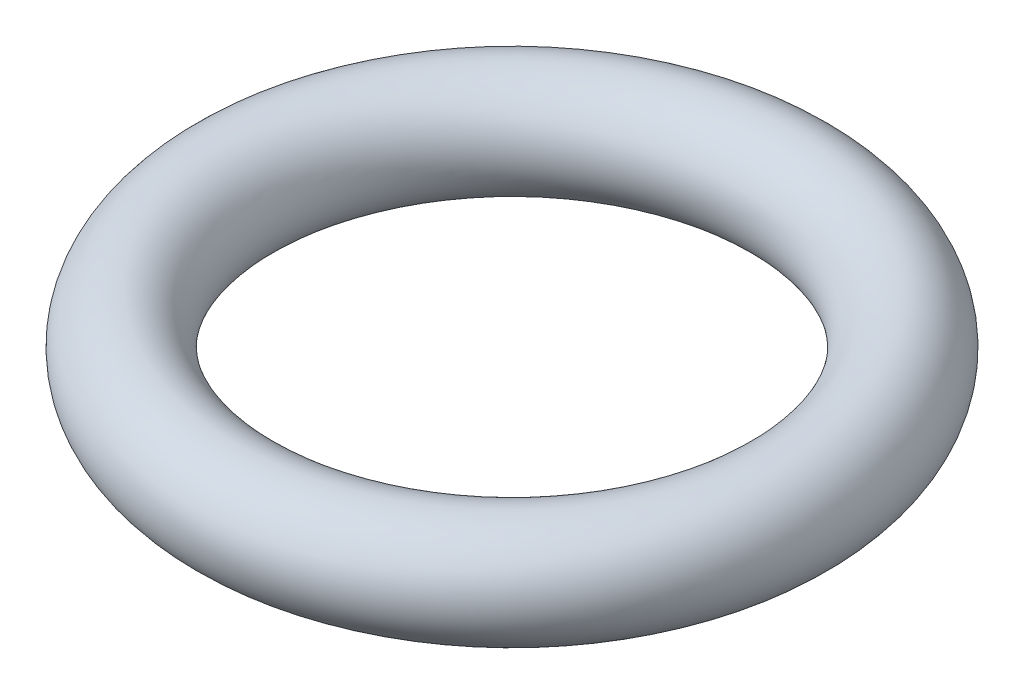
ISO-10303-21;
HEADER;
FILE_DESCRIPTION(('STEP AP214'),'2;1');
FILE_NAME('part.step','',(''),(''),'','','');
FILE_SCHEMA(('AUTOMOTIVE_DESIGN { 1 0 10303 214 1 1 1 1 }'));
ENDSEC;
DATA;
#1=APPLICATION_CONTEXT('core data for automotive mechanical design processes');
#2=APPLICATION_PROTOCOL_DEFINITION('international standard','automotive_design',2000,#1);
#3=PRODUCT_CONTEXT('',#1,'mechanical');
#4=PRODUCT('Part','Part','',(#3));
#5=PRODUCT_RELATED_PRODUCT_CATEGORY('part','',(#4));
#6=PRODUCT_DEFINITION_FORMATION('','',#4);
#7=PRODUCT_DEFINITION_CONTEXT('part definition',#1,'design');
#8=PRODUCT_DEFINITION('design','',#6,#7);
#9=PRODUCT_DEFINITION_SHAPE('','',#8);
#10=(LENGTH_UNIT() NAMED_UNIT(*) SI_UNIT(.MILLI.,.METRE.));
#11=(NAMED_UNIT(*) PLANE_ANGLE_UNIT() SI_UNIT($,.RADIAN.));
#12=(NAMED_UNIT(*) SI_UNIT($,.STERADIAN.) SOLID_ANGLE_UNIT());
#13=UNCERTAINTY_MEASURE_WITH_UNIT(LENGTH_MEASURE(1.E-05),#10,'distance_accuracy_value','');
#14=(GEOMETRIC_REPRESENTATION_CONTEXT(3) GLOBAL_UNCERTAINTY_ASSIGNED_CONTEXT((#13)) GLOBAL_UNIT_ASSIGNED_CONTEXT((#10,
#11,#12)) REPRESENTATION_CONTEXT('',''));
#15=CARTESIAN_POINT('',(0.,0.,0.));
#16=DIRECTION('',(0.,0.,1.));
#17=DIRECTION('',(1.,0.,0.));
#18=AXIS2_PLACEMENT_3D('',#15,#16,#17);
#19=CARTESIAN_POINT('',(0.,0.,0.));
#20=DIRECTION('',(0.,1.,0.));
#21=DIRECTION('',(0.,0.,1.));
#22=AXIS2_PLACEMENT_3D('',#19,#20,#21);
#23=TOROIDAL_SURFACE('',#22,11.645,2.24);
#24=CARTESIAN_POINT('',(0.,0.,11.645));
#25=DIRECTION('',(1.,0.,0.));
#26=DIRECTION('',(0.,0.,-1.));
#27=AXIS2_PLACEMENT_3D('',#24,#25,#26);
#28=CIRCLE('',#27,2.24);
#29=CARTESIAN_POINT('',(0.,0.,13.885));
#30=VERTEX_POINT('',#29);
#31=EDGE_CURVE('E10',#30,#30,#28,.T.);
#32=CARTESIAN_POINT('',(0.,0.,0.));
#33=DIRECTION('',(0.,1.,0.));
#34=DIRECTION('',(0.,0.,1.));
#35=AXIS2_PLACEMENT_3D('',#32,#33,#34);
#36=CIRCLE('',#35,13.885);
#37=EDGE_CURVE('',#30,#30,#36,.T.);
#38=ORIENTED_EDGE('',*,*,#31,.T.);
#39=ORIENTED_EDGE('',*,*,#31,.F.);
#40=ORIENTED_EDGE('',*,*,#37,.T.);
#41=ORIENTED_EDGE('',*,*,#37,.F.);
#42=EDGE_LOOP('',(#38,#40,#39,#41));
#43=FACE_BOUND('',#42,.T.);
#44=ADVANCED_FACE('F32',(#43),#23,.T.);
#45=CLOSED_SHELL('',(#44));
#46=MANIFOLD_SOLID_BREP('B2',#45);
#47=ADVANCED_BREP_SHAPE_REPRESENTATION('',(#18,#46),#14);
#48=SHAPE_DEFINITION_REPRESENTATION(#9,#47);
ENDSEC;
END-ISO-10303-21;
